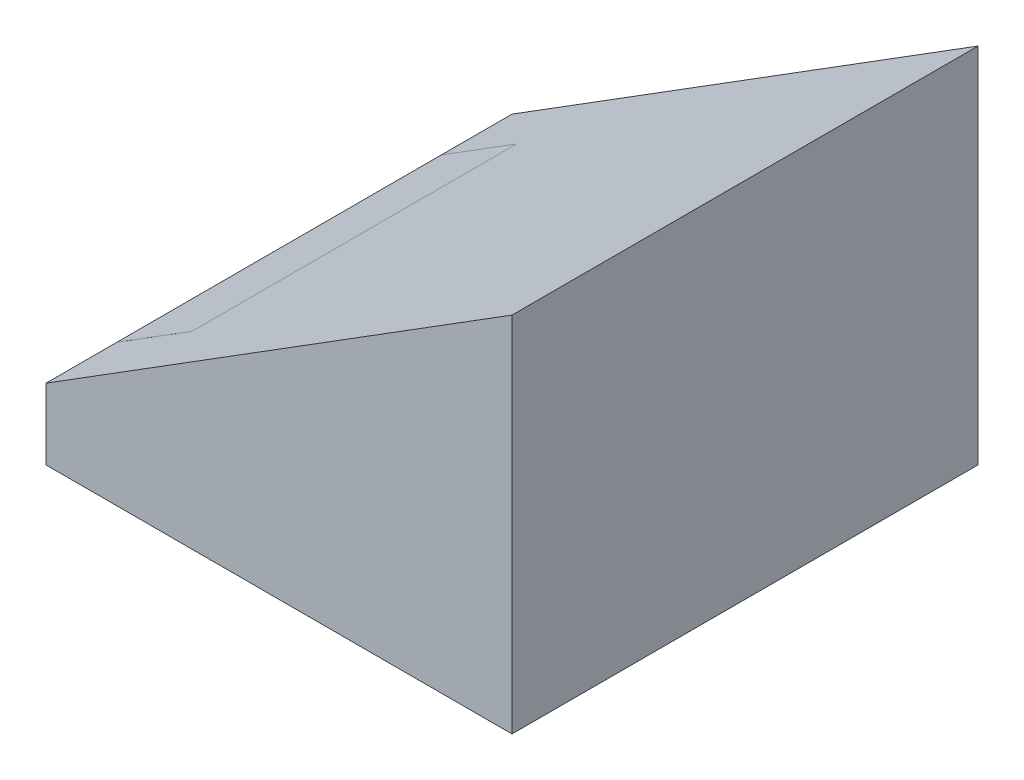
ISO-10303-21;
HEADER;
FILE_DESCRIPTION(('STEP AP214'),'2;1');
FILE_NAME('part.step','',(''),(''),'','','');
FILE_SCHEMA(('AUTOMOTIVE_DESIGN { 1 0 10303 214 1 1 1 1 }'));
ENDSEC;
DATA;
#1=APPLICATION_CONTEXT('core data for automotive mechanical design processes');
#2=APPLICATION_PROTOCOL_DEFINITION('international standard','automotive_design',2000,#1);
#3=PRODUCT_CONTEXT('',#1,'mechanical');
#4=PRODUCT('Part','Part','',(#3));
#5=PRODUCT_RELATED_PRODUCT_CATEGORY('part','',(#4));
#6=PRODUCT_DEFINITION_FORMATION('','',#4);
#7=PRODUCT_DEFINITION_CONTEXT('part definition',#1,'design');
#8=PRODUCT_DEFINITION('design','',#6,#7);
#9=PRODUCT_DEFINITION_SHAPE('','',#8);
#10=(LENGTH_UNIT() NAMED_UNIT(*) SI_UNIT(.MILLI.,.METRE.));
#11=(NAMED_UNIT(*) PLANE_ANGLE_UNIT() SI_UNIT($,.RADIAN.));
#12=(NAMED_UNIT(*) SI_UNIT($,.STERADIAN.) SOLID_ANGLE_UNIT());
#13=UNCERTAINTY_MEASURE_WITH_UNIT(LENGTH_MEASURE(1.E-05),#10,'distance_accuracy_value','');
#14=(GEOMETRIC_REPRESENTATION_CONTEXT(3) GLOBAL_UNCERTAINTY_ASSIGNED_CONTEXT((#13)) GLOBAL_UNIT_ASSIGNED_CONTEXT((#10,
#11,#12)) REPRESENTATION_CONTEXT('',''));
#15=CARTESIAN_POINT('',(0.,0.,0.));
#16=DIRECTION('',(0.,0.,1.));
#17=DIRECTION('',(1.,0.,0.));
#18=AXIS2_PLACEMENT_3D('',#15,#16,#17);
#19=CARTESIAN_POINT('',(8.58196721311474,1.20037249534662,6.69914701757875));
#20=DIRECTION('',(1.,0.,0.));
#21=DIRECTION('',(0.,0.,-1.));
#22=AXIS2_PLACEMENT_3D('',#19,#20,#21);
#23=PLANE('',#22);
#24=DIRECTION('',(0.,-1.,0.));
#25=VECTOR('',#24,1.);
#26=CARTESIAN_POINT('',(8.58196721311474,1.20037249534662,1.19914701757875));
#27=LINE('',#26,#25);
#28=CARTESIAN_POINT('',(8.58196721311474,1.20037249534662,1.19914701757875));
#29=VERTEX_POINT('',#28);
#30=CARTESIAN_POINT('',(8.58196721311474,0.,1.19914701757875));
#31=VERTEX_POINT('',#30);
#32=EDGE_CURVE('E114',#29,#31,#27,.T.);
#33=ORIENTED_EDGE('',*,*,#32,.T.);
#34=DIRECTION('',(0.,0.,-1.));
#35=VECTOR('',#34,1.);
#36=CARTESIAN_POINT('',(8.58196721311474,0.,6.69914701757875));
#37=LINE('',#36,#35);
#38=CARTESIAN_POINT('',(8.58196721311474,0.,6.69914701757875));
#39=VERTEX_POINT('',#38);
#40=EDGE_CURVE('E12',#39,#31,#37,.T.);
#41=ORIENTED_EDGE('',*,*,#40,.F.);
#42=DIRECTION('',(0.,-1.,0.));
#43=VECTOR('',#42,1.);
#44=CARTESIAN_POINT('',(8.58196721311474,1.20037249534662,6.69914701757875));
#45=LINE('',#44,#43);
#46=CARTESIAN_POINT('',(8.58196721311474,1.20037249534662,6.69914701757875));
#47=VERTEX_POINT('',#46);
#48=EDGE_CURVE('E102',#47,#39,#45,.T.);
#49=ORIENTED_EDGE('',*,*,#48,.F.);
#50=DIRECTION('',(0.,0.,-1.));
#51=VECTOR('',#50,1.);
#52=CARTESIAN_POINT('',(8.58196721311474,1.20037249534662,6.69914701757875));
#53=LINE('',#52,#51);
#54=EDGE_CURVE('E110',#47,#29,#53,.T.);
#55=ORIENTED_EDGE('',*,*,#54,.T.);
#56=EDGE_LOOP('',(#33,#41,#49,#55));
#57=FACE_BOUND('',#56,.T.);
#58=ADVANCED_FACE('F51',(#57),#23,.F.);
#59=CARTESIAN_POINT('',(9.85823644364224,0.,6.69914701757875));
#60=DIRECTION('',(0.,1.,0.));
#61=DIRECTION('',(0.,0.,1.));
#62=AXIS2_PLACEMENT_3D('',#59,#60,#61);
#63=PLANE('',#62);
#64=DIRECTION('',(1.,0.,0.));
#65=VECTOR('',#64,1.);
#66=CARTESIAN_POINT('',(9.85823644364224,0.,1.19914701757875));
#67=LINE('',#66,#65);
#68=CARTESIAN_POINT('',(9.85823644364224,0.,1.19914701757875));
#69=VERTEX_POINT('',#68);
#70=EDGE_CURVE('E106',#31,#69,#67,.T.);
#71=ORIENTED_EDGE('',*,*,#70,.T.);
#72=DIRECTION('',(0.,0.,-1.));
#73=VECTOR('',#72,1.);
#74=CARTESIAN_POINT('',(9.85823644364224,0.,6.69914701757875));
#75=LINE('',#74,#73);
#76=CARTESIAN_POINT('',(9.85823644364224,0.,6.69914701757875));
#77=VERTEX_POINT('',#76);
#78=EDGE_CURVE('E59',#77,#69,#75,.T.);
#79=ORIENTED_EDGE('',*,*,#78,.F.);
#80=DIRECTION('',(1.,0.,0.));
#81=VECTOR('',#80,1.);
#82=CARTESIAN_POINT('',(9.85823644364224,0.,6.69914701757875));
#83=LINE('',#82,#81);
#84=EDGE_CURVE('E97',#39,#77,#83,.T.);
#85=ORIENTED_EDGE('',*,*,#84,.F.);
#86=ORIENTED_EDGE('',*,*,#40,.T.);
#87=EDGE_LOOP('',(#71,#79,#85,#86));
#88=FACE_BOUND('',#87,.T.);
#89=ADVANCED_FACE('F105',(#88),#63,.F.);
#90=CARTESIAN_POINT('',(9.85823644364224,2.,6.69914701757875));
#91=DIRECTION('',(-1.,0.,0.));
#92=DIRECTION('',(0.,0.,1.));
#93=AXIS2_PLACEMENT_3D('',#90,#91,#92);
#94=PLANE('',#93);
#95=DIRECTION('',(0.,1.,0.));
#96=VECTOR('',#95,1.);
#97=CARTESIAN_POINT('',(9.85823644364224,2.,1.19914701757875));
#98=LINE('',#97,#96);
#99=CARTESIAN_POINT('',(9.85823644364224,2.,1.19914701757875));
#100=VERTEX_POINT('',#99);
#101=EDGE_CURVE('E84',#69,#100,#98,.T.);
#102=ORIENTED_EDGE('',*,*,#101,.T.);
#103=DIRECTION('',(0.,0.,-1.));
#104=VECTOR('',#103,1.);
#105=CARTESIAN_POINT('',(9.85823644364224,2.,6.69914701757875));
#106=LINE('',#105,#104);
#107=CARTESIAN_POINT('',(9.85823644364224,2.,6.69914701757875));
#108=VERTEX_POINT('',#107);
#109=EDGE_CURVE('E107',#108,#100,#106,.T.);
#110=ORIENTED_EDGE('',*,*,#109,.F.);
#111=DIRECTION('',(0.,1.,0.));
#112=VECTOR('',#111,1.);
#113=CARTESIAN_POINT('',(9.85823644364224,2.,6.69914701757875));
#114=LINE('',#113,#112);
#115=EDGE_CURVE('E100',#77,#108,#114,.T.);
#116=ORIENTED_EDGE('',*,*,#115,.F.);
#117=ORIENTED_EDGE('',*,*,#78,.T.);
#118=EDGE_LOOP('',(#102,#110,#116,#117));
#119=FACE_BOUND('',#118,.T.);
#120=ADVANCED_FACE('F108',(#119),#94,.F.);
#121=CARTESIAN_POINT('',(8.58196721311474,1.20037249534662,6.69914701757875));
#122=DIRECTION('',(0.530934086750098,-0.847413119751423,0.));
#123=DIRECTION('',(0.847413119751423,0.530934086750098,0.));
#124=AXIS2_PLACEMENT_3D('',#121,#122,#123);
#125=PLANE('',#124);
#126=DIRECTION('',(-0.847413119751423,-0.530934086750098,0.));
#127=VECTOR('',#126,1.);
#128=CARTESIAN_POINT('',(8.58196721311474,1.20037249534662,1.19914701757875));
#129=LINE('',#128,#127);
#130=EDGE_CURVE('E90',#100,#29,#129,.T.);
#131=ORIENTED_EDGE('',*,*,#130,.T.);
#132=ORIENTED_EDGE('',*,*,#54,.F.);
#133=DIRECTION('',(-0.847413119751423,-0.530934086750098,0.));
#134=VECTOR('',#133,1.);
#135=CARTESIAN_POINT('',(8.58196721311474,1.20037249534662,6.69914701757875));
#136=LINE('',#135,#134);
#137=EDGE_CURVE('E67',#108,#47,#136,.T.);
#138=ORIENTED_EDGE('',*,*,#137,.F.);
#139=ORIENTED_EDGE('',*,*,#109,.T.);
#140=EDGE_LOOP('',(#131,#132,#138,#139));
#141=FACE_BOUND('',#140,.T.);
#142=ADVANCED_FACE('F121',(#141),#125,.F.);
#143=CARTESIAN_POINT('',(0.,0.,6.69914701757875));
#144=DIRECTION('',(0.,0.,-1.));
#145=DIRECTION('',(-1.,0.,0.));
#146=AXIS2_PLACEMENT_3D('',#143,#144,#145);
#147=PLANE('',#146);
#148=ORIENTED_EDGE('',*,*,#48,.T.);
#149=ORIENTED_EDGE('',*,*,#84,.T.);
#150=ORIENTED_EDGE('',*,*,#115,.T.);
#151=ORIENTED_EDGE('',*,*,#137,.T.);
#152=EDGE_LOOP('',(#148,#149,#150,#151));
#153=FACE_BOUND('',#152,.T.);
#154=ADVANCED_FACE('F98',(#153),#147,.F.);
#155=CARTESIAN_POINT('',(0.,0.,1.19914701757875));
#156=DIRECTION('',(0.,0.,-1.));
#157=DIRECTION('',(-1.,0.,0.));
#158=AXIS2_PLACEMENT_3D('',#155,#156,#157);
#159=PLANE('',#158);
#160=ORIENTED_EDGE('',*,*,#32,.F.);
#161=ORIENTED_EDGE('',*,*,#130,.F.);
#162=ORIENTED_EDGE('',*,*,#101,.F.);
#163=ORIENTED_EDGE('',*,*,#70,.F.);
#164=EDGE_LOOP('',(#160,#161,#162,#163));
#165=FACE_BOUND('',#164,.T.);
#166=ADVANCED_FACE('F124',(#165),#159,.T.);
#167=CLOSED_SHELL('',(#58,#89,#120,#142,#154,#166));
#168=MANIFOLD_SOLID_BREP('B2',#167);
#169=CARTESIAN_POINT('',(0.,0.,7.9));
#170=DIRECTION('',(0.,0.,-1.));
#171=DIRECTION('',(-1.,0.,0.));
#172=AXIS2_PLACEMENT_3D('',#169,#170,#171);
#173=PLANE('',#172);
#174=DIRECTION('',(0.,1.,0.));
#175=VECTOR('',#174,1.);
#176=CARTESIAN_POINT('',(16.4819672131147,0.,7.9));
#177=LINE('',#176,#175);
#178=CARTESIAN_POINT('',(16.4819672131147,0.,7.9));
#179=VERTEX_POINT('',#178);
#180=CARTESIAN_POINT('',(16.4819672131147,6.15,7.9));
#181=VERTEX_POINT('',#180);
#182=EDGE_CURVE('E256',#179,#181,#177,.T.);
#183=ORIENTED_EDGE('',*,*,#182,.T.);
#184=DIRECTION('',(0.847413119751423,0.530934086750098,0.));
#185=VECTOR('',#184,1.);
#186=CARTESIAN_POINT('',(8.58196721311474,1.20037249534662,7.9));
#187=LINE('',#186,#185);
#188=CARTESIAN_POINT('',(8.58196721311474,1.20037249534662,7.9));
#189=VERTEX_POINT('',#188);
#190=EDGE_CURVE('E301',#189,#181,#187,.T.);
#191=ORIENTED_EDGE('',*,*,#190,.F.);
#192=DIRECTION('',(0.,1.,0.));
#193=VECTOR('',#192,1.);
#194=CARTESIAN_POINT('',(8.58196721311474,0.,7.9));
#195=LINE('',#194,#193);
#196=CARTESIAN_POINT('',(8.58196721311474,0.,7.9));
#197=VERTEX_POINT('',#196);
#198=EDGE_CURVE('E313',#197,#189,#195,.T.);
#199=ORIENTED_EDGE('',*,*,#198,.F.);
#200=DIRECTION('',(1.,0.,0.));
#201=VECTOR('',#200,1.);
#202=CARTESIAN_POINT('',(0.681967213114738,0.,7.9));
#203=LINE('',#202,#201);
#204=EDGE_CURVE('E251',#197,#179,#203,.T.);
#205=ORIENTED_EDGE('',*,*,#204,.T.);
#206=EDGE_LOOP('',(#183,#191,#199,#205));
#207=FACE_BOUND('',#206,.T.);
#208=ADVANCED_FACE('F175',(#207),#173,.F.);
#209=CARTESIAN_POINT('',(8.58196721311474,35.7679015680186,0.));
#210=DIRECTION('',(0.,0.,-1.));
#211=DIRECTION('',(-1.,0.,0.));
#212=AXIS2_PLACEMENT_3D('',#209,#210,#211);
#213=PLANE('',#212);
#214=DIRECTION('',(0.847413119751423,0.530934086750098,0.));
#215=VECTOR('',#214,1.);
#216=CARTESIAN_POINT('',(8.58196721311474,1.20037249534662,0.));
#217=LINE('',#216,#215);
#218=CARTESIAN_POINT('',(8.58196721311474,1.20037249534662,0.));
#219=VERTEX_POINT('',#218);
#220=CARTESIAN_POINT('',(16.4819672131147,6.15,0.));
#221=VERTEX_POINT('',#220);
#222=EDGE_CURVE('E298',#219,#221,#217,.T.);
#223=ORIENTED_EDGE('',*,*,#222,.T.);
#224=DIRECTION('',(0.,-1.,0.));
#225=VECTOR('',#224,1.);
#226=CARTESIAN_POINT('',(16.4819672131147,35.7679015680186,0.));
#227=LINE('',#226,#225);
#228=CARTESIAN_POINT('',(16.4819672131147,0.,0.));
#229=VERTEX_POINT('',#228);
#230=EDGE_CURVE('E250',#221,#229,#227,.T.);
#231=ORIENTED_EDGE('',*,*,#230,.T.);
#232=DIRECTION('',(-1.,0.,0.));
#233=VECTOR('',#232,1.);
#234=CARTESIAN_POINT('',(0.681967213114738,0.,0.));
#235=LINE('',#234,#233);
#236=CARTESIAN_POINT('',(8.58196721311474,0.,0.));
#237=VERTEX_POINT('',#236);
#238=EDGE_CURVE('E237',#229,#237,#235,.T.);
#239=ORIENTED_EDGE('',*,*,#238,.T.);
#240=DIRECTION('',(0.,1.,0.));
#241=VECTOR('',#240,1.);
#242=CARTESIAN_POINT('',(8.58196721311474,0.,0.));
#243=LINE('',#242,#241);
#244=EDGE_CURVE('E305',#237,#219,#243,.T.);
#245=ORIENTED_EDGE('',*,*,#244,.T.);
#246=EDGE_LOOP('',(#223,#231,#239,#245));
#247=FACE_BOUND('',#246,.T.);
#248=ADVANCED_FACE('F177',(#247),#213,.T.);
#249=CARTESIAN_POINT('',(16.4819672131147,0.,7.9));
#250=DIRECTION('',(-1.,0.,0.));
#251=DIRECTION('',(0.,0.,1.));
#252=AXIS2_PLACEMENT_3D('',#249,#250,#251);
#253=PLANE('',#252);
#254=ORIENTED_EDGE('',*,*,#230,.F.);
#255=DIRECTION('',(0.,0.,1.));
#256=VECTOR('',#255,1.);
#257=CARTESIAN_POINT('',(16.4819672131147,6.15,0.));
#258=LINE('',#257,#256);
#259=EDGE_CURVE('E262',#221,#181,#258,.T.);
#260=ORIENTED_EDGE('',*,*,#259,.T.);
#261=ORIENTED_EDGE('',*,*,#182,.F.);
#262=DIRECTION('',(0.,0.,-1.));
#263=VECTOR('',#262,1.);
#264=CARTESIAN_POINT('',(16.4819672131147,0.,7.9));
#265=LINE('',#264,#263);
#266=EDGE_CURVE('E233',#179,#229,#265,.T.);
#267=ORIENTED_EDGE('',*,*,#266,.T.);
#268=EDGE_LOOP('',(#254,#260,#261,#267));
#269=FACE_BOUND('',#268,.T.);
#270=ADVANCED_FACE('F290',(#269),#253,.F.);
#271=CARTESIAN_POINT('',(0.681967213114738,0.,7.9));
#272=DIRECTION('',(0.,1.,0.));
#273=DIRECTION('',(0.,0.,1.));
#274=AXIS2_PLACEMENT_3D('',#271,#272,#273);
#275=PLANE('',#274);
#276=ORIENTED_EDGE('',*,*,#204,.F.);
#277=DIRECTION('',(0.,0.,1.));
#278=VECTOR('',#277,1.);
#279=CARTESIAN_POINT('',(8.58196721311474,0.,0.));
#280=LINE('',#279,#278);
#281=CARTESIAN_POINT('',(8.58196721311474,0.,6.7));
#282=VERTEX_POINT('',#281);
#283=EDGE_CURVE('E306',#282,#197,#280,.T.);
#284=ORIENTED_EDGE('',*,*,#283,.F.);
#285=DIRECTION('',(1.,0.,0.));
#286=VECTOR('',#285,1.);
#287=CARTESIAN_POINT('',(0.,0.,6.7));
#288=LINE('',#287,#286);
#289=CARTESIAN_POINT('',(15.2819672131147,0.,6.7));
#290=VERTEX_POINT('',#289);
#291=EDGE_CURVE('E209',#282,#290,#288,.T.);
#292=ORIENTED_EDGE('',*,*,#291,.T.);
#293=DIRECTION('',(0.,0.,-1.));
#294=VECTOR('',#293,1.);
#295=CARTESIAN_POINT('',(15.2819672131147,0.,7.9));
#296=LINE('',#295,#294);
#297=CARTESIAN_POINT('',(15.2819672131147,0.,1.19904701757875));
#298=VERTEX_POINT('',#297);
#299=EDGE_CURVE('E216',#290,#298,#296,.T.);
#300=ORIENTED_EDGE('',*,*,#299,.T.);
#301=DIRECTION('',(-1.,0.,0.));
#302=VECTOR('',#301,1.);
#303=CARTESIAN_POINT('',(7.38292019553601,0.,1.19904701757875));
#304=LINE('',#303,#302);
#305=CARTESIAN_POINT('',(8.58196721311474,0.,1.19904701757875));
#306=VERTEX_POINT('',#305);
#307=EDGE_CURVE('E228',#298,#306,#304,.T.);
#308=ORIENTED_EDGE('',*,*,#307,.T.);
#309=EDGE_CURVE('E309',#237,#306,#280,.T.);
#310=ORIENTED_EDGE('',*,*,#309,.F.);
#311=ORIENTED_EDGE('',*,*,#238,.F.);
#312=ORIENTED_EDGE('',*,*,#266,.F.);
#313=EDGE_LOOP('',(#276,#284,#292,#300,#308,#310,#311,#312));
#314=FACE_BOUND('',#313,.T.);
#315=ADVANCED_FACE('F225',(#314),#275,.F.);
#316=CARTESIAN_POINT('',(15.2819672131147,0.,7.9));
#317=DIRECTION('',(-1.,0.,0.));
#318=DIRECTION('',(0.,0.,1.));
#319=AXIS2_PLACEMENT_3D('',#316,#317,#318);
#320=PLANE('',#319);
#321=DIRECTION('',(0.,-1.,0.));
#322=VECTOR('',#321,1.);
#323=CARTESIAN_POINT('',(15.2819672131147,2.,1.19904701757875));
#324=LINE('',#323,#322);
#325=CARTESIAN_POINT('',(15.2819672131147,2.,1.19904701757875));
#326=VERTEX_POINT('',#325);
#327=EDGE_CURVE('E214',#326,#298,#324,.T.);
#328=ORIENTED_EDGE('',*,*,#327,.T.);
#329=ORIENTED_EDGE('',*,*,#299,.F.);
#330=DIRECTION('',(0.,1.,0.));
#331=VECTOR('',#330,1.);
#332=CARTESIAN_POINT('',(15.2819672131147,0.,6.7));
#333=LINE('',#332,#331);
#334=CARTESIAN_POINT('',(15.2819672131147,2.,6.7));
#335=VERTEX_POINT('',#334);
#336=EDGE_CURVE('E221',#290,#335,#333,.T.);
#337=ORIENTED_EDGE('',*,*,#336,.T.);
#338=DIRECTION('',(0.,0.,-1.));
#339=VECTOR('',#338,1.);
#340=CARTESIAN_POINT('',(15.2819672131147,2.,7.9));
#341=LINE('',#340,#339);
#342=EDGE_CURVE('E218',#335,#326,#341,.T.);
#343=ORIENTED_EDGE('',*,*,#342,.T.);
#344=EDGE_LOOP('',(#328,#329,#337,#343));
#345=FACE_BOUND('',#344,.T.);
#346=ADVANCED_FACE('F215',(#345),#320,.T.);
#347=CARTESIAN_POINT('',(0.681967213114738,2.,7.9));
#348=DIRECTION('',(0.,-1.,0.));
#349=DIRECTION('',(1.,0.,0.));
#350=AXIS2_PLACEMENT_3D('',#347,#348,#349);
#351=PLANE('',#350);
#352=DIRECTION('',(0.,0.,1.));
#353=VECTOR('',#352,1.);
#354=CARTESIAN_POINT('',(9.85823644364224,2.,7.9));
#355=LINE('',#354,#353);
#356=CARTESIAN_POINT('',(9.85823644364224,2.,1.19904701757875));
#357=VERTEX_POINT('',#356);
#358=CARTESIAN_POINT('',(9.85823644364224,2.,6.7));
#359=VERTEX_POINT('',#358);
#360=EDGE_CURVE('E279',#357,#359,#355,.T.);
#361=ORIENTED_EDGE('',*,*,#360,.F.);
#362=DIRECTION('',(-1.,0.,0.));
#363=VECTOR('',#362,1.);
#364=CARTESIAN_POINT('',(7.38292019553601,2.,1.19904701757875));
#365=LINE('',#364,#363);
#366=EDGE_CURVE('E184',#326,#357,#365,.T.);
#367=ORIENTED_EDGE('',*,*,#366,.F.);
#368=ORIENTED_EDGE('',*,*,#342,.F.);
#369=DIRECTION('',(-1.,0.,0.));
#370=VECTOR('',#369,1.);
#371=CARTESIAN_POINT('',(0.,2.,6.7));
#372=LINE('',#371,#370);
#373=EDGE_CURVE('E240',#335,#359,#372,.T.);
#374=ORIENTED_EDGE('',*,*,#373,.T.);
#375=EDGE_LOOP('',(#361,#367,#368,#374));
#376=FACE_BOUND('',#375,.T.);
#377=ADVANCED_FACE('F265',(#376),#351,.T.);
#378=CARTESIAN_POINT('',(0.,0.,6.7));
#379=DIRECTION('',(0.,0.,-1.));
#380=DIRECTION('',(-1.,0.,0.));
#381=AXIS2_PLACEMENT_3D('',#378,#379,#380);
#382=PLANE('',#381);
#383=DIRECTION('',(-0.847413119751423,-0.530934086750098,0.));
#384=VECTOR('',#383,1.);
#385=CARTESIAN_POINT('',(1.87910715176168,-2.99920478560474,6.7));
#386=LINE('',#385,#384);
#387=CARTESIAN_POINT('',(8.58196721311474,1.20037249534662,6.7));
#388=VERTEX_POINT('',#387);
#389=EDGE_CURVE('E270',#359,#388,#386,.T.);
#390=ORIENTED_EDGE('',*,*,#389,.F.);
#391=ORIENTED_EDGE('',*,*,#373,.F.);
#392=ORIENTED_EDGE('',*,*,#336,.F.);
#393=ORIENTED_EDGE('',*,*,#291,.F.);
#394=DIRECTION('',(0.,-1.,0.));
#395=VECTOR('',#394,1.);
#396=CARTESIAN_POINT('',(8.58196721311474,0.,6.7));
#397=LINE('',#396,#395);
#398=EDGE_CURVE('E273',#388,#282,#397,.T.);
#399=ORIENTED_EDGE('',*,*,#398,.F.);
#400=EDGE_LOOP('',(#390,#391,#392,#393,#399));
#401=FACE_BOUND('',#400,.T.);
#402=ADVANCED_FACE('F267',(#401),#382,.T.);
#403=CARTESIAN_POINT('',(7.38292019553601,2.,1.19904701757875));
#404=DIRECTION('',(0.,0.,1.));
#405=DIRECTION('',(1.,0.,0.));
#406=AXIS2_PLACEMENT_3D('',#403,#404,#405);
#407=PLANE('',#406);
#408=DIRECTION('',(0.847413119751423,0.530934086750098,0.));
#409=VECTOR('',#408,1.);
#410=CARTESIAN_POINT('',(8.08068957910341,0.886304449173195,1.19904701757875));
#411=LINE('',#410,#409);
#412=CARTESIAN_POINT('',(8.58196721311474,1.20037249534662,1.19904701757875));
#413=VERTEX_POINT('',#412);
#414=EDGE_CURVE('E282',#413,#357,#411,.T.);
#415=ORIENTED_EDGE('',*,*,#414,.F.);
#416=DIRECTION('',(0.,1.,0.));
#417=VECTOR('',#416,1.);
#418=CARTESIAN_POINT('',(8.58196721311474,2.,1.19904701757875));
#419=LINE('',#418,#417);
#420=EDGE_CURVE('E49',#306,#413,#419,.T.);
#421=ORIENTED_EDGE('',*,*,#420,.F.);
#422=ORIENTED_EDGE('',*,*,#307,.F.);
#423=ORIENTED_EDGE('',*,*,#327,.F.);
#424=ORIENTED_EDGE('',*,*,#366,.T.);
#425=EDGE_LOOP('',(#415,#421,#422,#423,#424));
#426=FACE_BOUND('',#425,.T.);
#427=ADVANCED_FACE('F232',(#426),#407,.T.);
#428=CARTESIAN_POINT('',(8.58196721311474,0.,0.));
#429=DIRECTION('',(1.,0.,0.));
#430=DIRECTION('',(0.,0.,-1.));
#431=AXIS2_PLACEMENT_3D('',#428,#429,#430);
#432=PLANE('',#431);
#433=ORIENTED_EDGE('',*,*,#398,.T.);
#434=ORIENTED_EDGE('',*,*,#283,.T.);
#435=ORIENTED_EDGE('',*,*,#198,.T.);
#436=DIRECTION('',(0.,0.,1.));
#437=VECTOR('',#436,1.);
#438=CARTESIAN_POINT('',(8.58196721311474,1.20037249534662,0.));
#439=LINE('',#438,#437);
#440=EDGE_CURVE('E318',#388,#189,#439,.T.);
#441=ORIENTED_EDGE('',*,*,#440,.F.);
#442=EDGE_LOOP('',(#433,#434,#435,#441));
#443=FACE_BOUND('',#442,.T.);
#444=ADVANCED_FACE('F332',(#443),#432,.F.);
#445=CARTESIAN_POINT('',(8.58196721311474,1.20037249534662,0.));
#446=DIRECTION('',(0.530934086750098,-0.847413119751423,0.));
#447=DIRECTION('',(0.847413119751423,0.530934086750098,0.));
#448=AXIS2_PLACEMENT_3D('',#445,#446,#447);
#449=PLANE('',#448);
#450=ORIENTED_EDGE('',*,*,#389,.T.);
#451=ORIENTED_EDGE('',*,*,#440,.T.);
#452=ORIENTED_EDGE('',*,*,#190,.T.);
#453=ORIENTED_EDGE('',*,*,#259,.F.);
#454=ORIENTED_EDGE('',*,*,#222,.F.);
#455=EDGE_CURVE('E317',#219,#413,#439,.T.);
#456=ORIENTED_EDGE('',*,*,#455,.T.);
#457=ORIENTED_EDGE('',*,*,#414,.T.);
#458=ORIENTED_EDGE('',*,*,#360,.T.);
#459=EDGE_LOOP('',(#450,#451,#452,#453,#454,#456,#457,#458));
#460=FACE_BOUND('',#459,.T.);
#461=ADVANCED_FACE('F295',(#460),#449,.F.);
#462=ORIENTED_EDGE('',*,*,#420,.T.);
#463=ORIENTED_EDGE('',*,*,#455,.F.);
#464=ORIENTED_EDGE('',*,*,#244,.F.);
#465=ORIENTED_EDGE('',*,*,#309,.T.);
#466=EDGE_LOOP('',(#462,#463,#464,#465));
#467=FACE_BOUND('',#466,.T.);
#468=ADVANCED_FACE('F337',(#467),#432,.F.);
#469=CLOSED_SHELL('',(#208,#248,#270,#315,#346,#377,#402,#427,#444,#461,#468));
#470=MANIFOLD_SOLID_BREP('B6',#469);
#471=ADVANCED_BREP_SHAPE_REPRESENTATION('',(#18,#168,#470),#14);
#472=SHAPE_DEFINITION_REPRESENTATION(#9,#471);
ENDSEC;
END-ISO-10303-21;
